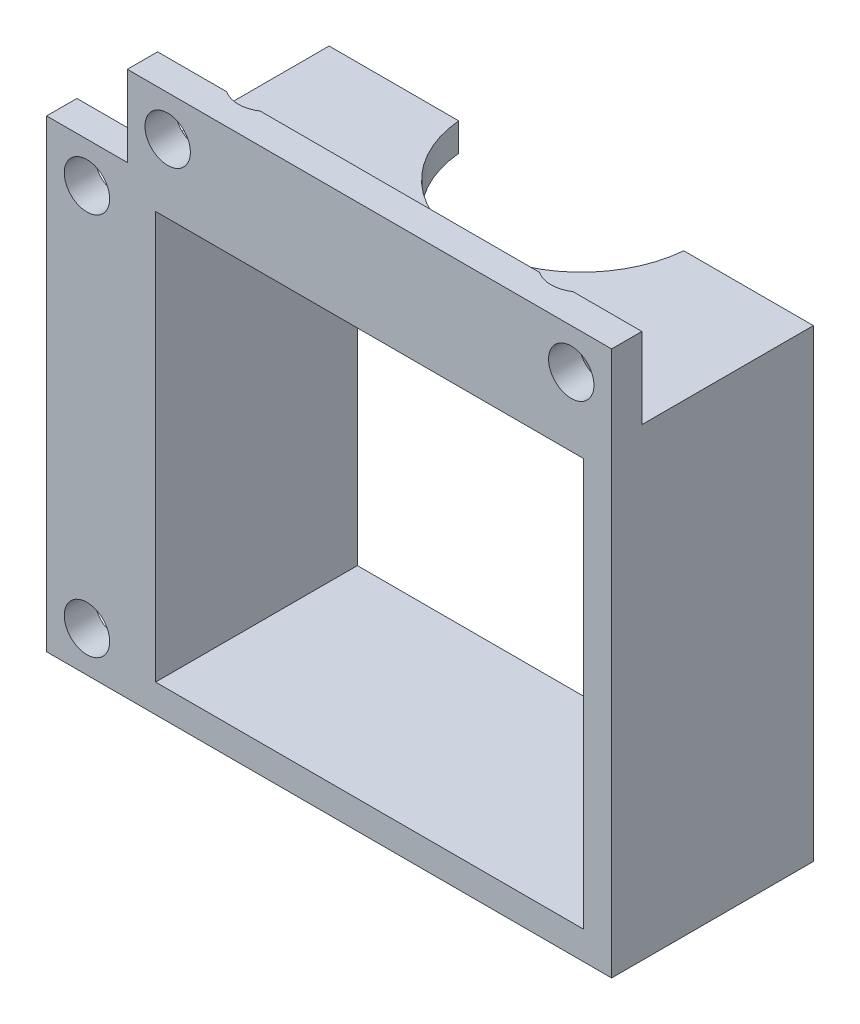
ISO-10303-21;
HEADER;
FILE_DESCRIPTION(('STEP AP214'),'2;1');
FILE_NAME('part.step','',(''),(''),'','','');
FILE_SCHEMA(('AUTOMOTIVE_DESIGN { 1 0 10303 214 1 1 1 1 }'));
ENDSEC;
DATA;
#1=APPLICATION_CONTEXT('core data for automotive mechanical design processes');
#2=APPLICATION_PROTOCOL_DEFINITION('international standard','automotive_design',2000,#1);
#3=PRODUCT_CONTEXT('',#1,'mechanical');
#4=PRODUCT('Part','Part','',(#3));
#5=PRODUCT_RELATED_PRODUCT_CATEGORY('part','',(#4));
#6=PRODUCT_DEFINITION_FORMATION('','',#4);
#7=PRODUCT_DEFINITION_CONTEXT('part definition',#1,'design');
#8=PRODUCT_DEFINITION('design','',#6,#7);
#9=PRODUCT_DEFINITION_SHAPE('','',#8);
#10=(LENGTH_UNIT() NAMED_UNIT(*) SI_UNIT(.MILLI.,.METRE.));
#11=(NAMED_UNIT(*) PLANE_ANGLE_UNIT() SI_UNIT($,.RADIAN.));
#12=(NAMED_UNIT(*) SI_UNIT($,.STERADIAN.) SOLID_ANGLE_UNIT());
#13=UNCERTAINTY_MEASURE_WITH_UNIT(LENGTH_MEASURE(1.E-05),#10,'distance_accuracy_value','');
#14=(GEOMETRIC_REPRESENTATION_CONTEXT(3) GLOBAL_UNCERTAINTY_ASSIGNED_CONTEXT((#13)) GLOBAL_UNIT_ASSIGNED_CONTEXT((#10,
#11,#12)) REPRESENTATION_CONTEXT('',''));
#15=CARTESIAN_POINT('',(0.,0.,0.));
#16=DIRECTION('',(0.,0.,1.));
#17=DIRECTION('',(1.,0.,0.));
#18=AXIS2_PLACEMENT_3D('',#15,#16,#17);
#19=CARTESIAN_POINT('',(0.,0.,-3.));
#20=DIRECTION('',(0.,0.,1.));
#21=DIRECTION('',(1.,0.,0.));
#22=AXIS2_PLACEMENT_3D('',#19,#20,#21);
#23=PLANE('',#22);
#24=CARTESIAN_POINT('',(15.8932700007655,-22.5,-3.));
#25=DIRECTION('',(0.,0.,1.));
#26=DIRECTION('',(1.,0.,0.));
#27=AXIS2_PLACEMENT_3D('',#24,#25,#26);
#28=CIRCLE('',#27,2.25);
#29=CARTESIAN_POINT('',(18.1432700007655,-22.5,-3.));
#30=VERTEX_POINT('',#29);
#31=EDGE_CURVE('E191',#30,#30,#28,.T.);
#32=ORIENTED_EDGE('',*,*,#31,.T.);
#33=EDGE_LOOP('',(#32));
#34=FACE_BOUND('',#33,.T.);
#35=DIRECTION('',(-1.,0.,0.));
#36=VECTOR('',#35,1.);
#37=CARTESIAN_POINT('',(0.,-26.5,-3.));
#38=LINE('',#37,#36);
#39=CARTESIAN_POINT('',(19.8932700007655,-26.5,-3.));
#40=VERTEX_POINT('',#39);
#41=CARTESIAN_POINT('',(13.0515823959432,-26.5,-3.));
#42=VERTEX_POINT('',#41);
#43=EDGE_CURVE('E189',#40,#42,#38,.T.);
#44=ORIENTED_EDGE('',*,*,#43,.T.);
#45=DIRECTION('',(0.,1.,0.));
#46=VECTOR('',#45,1.);
#47=CARTESIAN_POINT('',(13.0515823959432,-34.9852813742386,-3.));
#48=LINE('',#47,#46);
#49=CARTESIAN_POINT('',(13.0515823959432,-18.5,-3.));
#50=VERTEX_POINT('',#49);
#51=EDGE_CURVE('E11',#42,#50,#48,.T.);
#52=ORIENTED_EDGE('',*,*,#51,.T.);
#53=DIRECTION('',(-1.,0.,0.));
#54=VECTOR('',#53,1.);
#55=CARTESIAN_POINT('',(0.,-18.5,-3.));
#56=LINE('',#55,#54);
#57=CARTESIAN_POINT('',(19.8932700007655,-18.5,-3.));
#58=VERTEX_POINT('',#57);
#59=EDGE_CURVE('E224',#58,#50,#56,.T.);
#60=ORIENTED_EDGE('',*,*,#59,.F.);
#61=DIRECTION('',(0.,-1.,0.));
#62=VECTOR('',#61,1.);
#63=CARTESIAN_POINT('',(19.8932700007655,0.,-3.));
#64=LINE('',#63,#62);
#65=EDGE_CURVE('E187',#58,#40,#64,.T.);
#66=ORIENTED_EDGE('',*,*,#65,.T.);
#67=EDGE_LOOP('',(#44,#52,#60,#66));
#68=FACE_BOUND('',#67,.T.);
#69=ADVANCED_FACE('F37',(#34,#68),#23,.F.);
#70=CARTESIAN_POINT('',(9.7349576055878,-18.5,-3.));
#71=VERTEX_POINT('',#70);
#72=CARTESIAN_POINT('',(-17.9484176040568,-18.5,-3.));
#73=VERTEX_POINT('',#72);
#74=EDGE_CURVE('E228',#71,#73,#56,.T.);
#75=ORIENTED_EDGE('',*,*,#74,.F.);
#76=DIRECTION('',(0.,1.,0.));
#77=VECTOR('',#76,1.);
#78=CARTESIAN_POINT('',(9.7349576055878,-34.9852813742386,-3.));
#79=LINE('',#78,#77);
#80=CARTESIAN_POINT('',(9.7349576055878,-26.5,-3.));
#81=VERTEX_POINT('',#80);
#82=EDGE_CURVE('E45',#71,#81,#79,.F.);
#83=ORIENTED_EDGE('',*,*,#82,.T.);
#84=CARTESIAN_POINT('',(-17.9484176040568,-26.5,-3.));
#85=VERTEX_POINT('',#84);
#86=EDGE_CURVE('E186',#81,#85,#38,.T.);
#87=ORIENTED_EDGE('',*,*,#86,.T.);
#88=DIRECTION('',(0.,1.,0.));
#89=VECTOR('',#88,1.);
#90=CARTESIAN_POINT('',(-17.9484176040568,-34.9852813742386,-3.));
#91=LINE('',#90,#89);
#92=EDGE_CURVE('E167',#85,#73,#91,.T.);
#93=ORIENTED_EDGE('',*,*,#92,.T.);
#94=EDGE_LOOP('',(#75,#83,#87,#93));
#95=FACE_BOUND('',#94,.T.);
#96=ADVANCED_FACE('F347',(#95),#23,.F.);
#97=CARTESIAN_POINT('',(-28.1067299992345,-26.5,-20.));
#98=DIRECTION('',(0.,1.,0.));
#99=DIRECTION('',(0.,0.,1.));
#100=AXIS2_PLACEMENT_3D('',#97,#98,#99);
#101=PLANE('',#100);
#102=DIRECTION('',(0.,0.,1.));
#103=VECTOR('',#102,1.);
#104=CARTESIAN_POINT('',(-28.1067299992345,-26.5,-3.));
#105=LINE('',#104,#103);
#106=CARTESIAN_POINT('',(-28.1067299992345,-26.5,-3.));
#107=VERTEX_POINT('',#106);
#108=CARTESIAN_POINT('',(-28.1067299992345,-26.5,0.));
#109=VERTEX_POINT('',#108);
#110=EDGE_CURVE('E217',#107,#109,#105,.T.);
#111=ORIENTED_EDGE('',*,*,#110,.F.);
#112=DIRECTION('',(-1.,0.,0.));
#113=VECTOR('',#112,1.);
#114=CARTESIAN_POINT('',(0.,-26.5,-3.));
#115=LINE('',#114,#113);
#116=CARTESIAN_POINT('',(-36.1067299992345,-26.5,-3.));
#117=VERTEX_POINT('',#116);
#118=EDGE_CURVE('E243',#107,#117,#115,.T.);
#119=ORIENTED_EDGE('',*,*,#118,.T.);
#120=DIRECTION('',(0.,0.,1.));
#121=VECTOR('',#120,1.);
#122=CARTESIAN_POINT('',(-36.1067299992345,-26.5,-3.));
#123=LINE('',#122,#121);
#124=CARTESIAN_POINT('',(-36.1067299992345,-26.5,0.));
#125=VERTEX_POINT('',#124);
#126=EDGE_CURVE('E250',#117,#125,#123,.T.);
#127=ORIENTED_EDGE('',*,*,#126,.T.);
#128=DIRECTION('',(-1.,0.,0.));
#129=VECTOR('',#128,1.);
#130=CARTESIAN_POINT('',(-28.1067299992345,-26.5,0.));
#131=LINE('',#130,#129);
#132=EDGE_CURVE('E321',#109,#125,#131,.T.);
#133=ORIENTED_EDGE('',*,*,#132,.F.);
#134=EDGE_LOOP('',(#111,#119,#127,#133));
#135=FACE_BOUND('',#134,.T.);
#136=ADVANCED_FACE('F372',(#135),#101,.T.);
#137=CARTESIAN_POINT('',(-28.1067299992345,-26.5,-20.));
#138=DIRECTION('',(-1.,0.,0.));
#139=DIRECTION('',(0.,0.,1.));
#140=AXIS2_PLACEMENT_3D('',#137,#138,#139);
#141=PLANE('',#140);
#142=DIRECTION('',(0.,-1.,0.));
#143=VECTOR('',#142,1.);
#144=CARTESIAN_POINT('',(-28.1067299992345,0.,-3.));
#145=LINE('',#144,#143);
#146=CARTESIAN_POINT('',(-28.1067299992345,-72.5,-3.));
#147=VERTEX_POINT('',#146);
#148=EDGE_CURVE('E240',#107,#147,#145,.T.);
#149=ORIENTED_EDGE('',*,*,#148,.F.);
#150=DIRECTION('',(0.,0.,1.));
#151=VECTOR('',#150,1.);
#152=CARTESIAN_POINT('',(-28.1067299992345,-26.5,-20.));
#153=LINE('',#152,#151);
#154=CARTESIAN_POINT('',(-28.1067299992345,-26.5,-20.));
#155=VERTEX_POINT('',#154);
#156=EDGE_CURVE('E179',#155,#107,#153,.T.);
#157=ORIENTED_EDGE('',*,*,#156,.F.);
#158=DIRECTION('',(0.,-1.,0.));
#159=VECTOR('',#158,1.);
#160=CARTESIAN_POINT('',(-28.1067299992345,-26.5,-20.));
#161=LINE('',#160,#159);
#162=CARTESIAN_POINT('',(-28.1067299992345,-72.5,-20.));
#163=VERTEX_POINT('',#162);
#164=EDGE_CURVE('E317',#155,#163,#161,.T.);
#165=ORIENTED_EDGE('',*,*,#164,.T.);
#166=DIRECTION('',(0.,0.,1.));
#167=VECTOR('',#166,1.);
#168=CARTESIAN_POINT('',(-28.1067299992345,-72.5,-20.));
#169=LINE('',#168,#167);
#170=EDGE_CURVE('E331',#163,#147,#169,.T.);
#171=ORIENTED_EDGE('',*,*,#170,.T.);
#172=EDGE_LOOP('',(#149,#157,#165,#171));
#173=FACE_BOUND('',#172,.T.);
#174=ADVANCED_FACE('F39',(#173),#141,.T.);
#175=ORIENTED_EDGE('',*,*,#86,.F.);
#176=CARTESIAN_POINT('',(11.3932700007655,-26.5,-5.5));
#177=DIRECTION('',(0.,1.,0.));
#178=DIRECTION('',(0.,0.,1.));
#179=AXIS2_PLACEMENT_3D('',#176,#177,#178);
#180=CIRCLE('',#179,3.);
#181=EDGE_CURVE('E58',#42,#81,#180,.F.);
#182=ORIENTED_EDGE('',*,*,#181,.F.);
#183=ORIENTED_EDGE('',*,*,#43,.F.);
#184=DIRECTION('',(0.,0.,1.));
#185=VECTOR('',#184,1.);
#186=CARTESIAN_POINT('',(19.8932700007655,-26.5,-20.));
#187=LINE('',#186,#185);
#188=CARTESIAN_POINT('',(19.8932700007655,-26.5,-20.));
#189=VERTEX_POINT('',#188);
#190=EDGE_CURVE('E338',#189,#40,#187,.T.);
#191=ORIENTED_EDGE('',*,*,#190,.F.);
#192=DIRECTION('',(-1.,0.,0.));
#193=VECTOR('',#192,1.);
#194=CARTESIAN_POINT('',(-28.1067299992345,-26.5,-20.));
#195=LINE('',#194,#193);
#196=CARTESIAN_POINT('',(7.04853781467297,-26.5,-20.));
#197=VERTEX_POINT('',#196);
#198=EDGE_CURVE('E328',#189,#197,#195,.T.);
#199=ORIENTED_EDGE('',*,*,#198,.T.);
#200=CARTESIAN_POINT('',(-4.1067299992345,-26.5,-21.));
#201=DIRECTION('',(0.,1.,0.));
#202=DIRECTION('',(0.,0.,1.));
#203=AXIS2_PLACEMENT_3D('',#200,#201,#202);
#204=CIRCLE('',#203,11.2);
#205=CARTESIAN_POINT('',(-15.261997813142,-26.5,-20.));
#206=VERTEX_POINT('',#205);
#207=EDGE_CURVE('E279',#206,#197,#204,.T.);
#208=ORIENTED_EDGE('',*,*,#207,.F.);
#209=EDGE_CURVE('E327',#206,#155,#195,.T.);
#210=ORIENTED_EDGE('',*,*,#209,.T.);
#211=ORIENTED_EDGE('',*,*,#156,.T.);
#212=CARTESIAN_POINT('',(-21.2650423944122,-26.5,-3.));
#213=VERTEX_POINT('',#212);
#214=EDGE_CURVE('E176',#213,#107,#38,.T.);
#215=ORIENTED_EDGE('',*,*,#214,.F.);
#216=CARTESIAN_POINT('',(-19.6067299992345,-26.5,-5.5));
#217=DIRECTION('',(0.,1.,0.));
#218=DIRECTION('',(0.,0.,1.));
#219=AXIS2_PLACEMENT_3D('',#216,#217,#218);
#220=CIRCLE('',#219,3.);
#221=EDGE_CURVE('E52',#85,#213,#220,.F.);
#222=ORIENTED_EDGE('',*,*,#221,.F.);
#223=EDGE_LOOP('',(#175,#182,#183,#191,#199,#208,#210,#211,#215,#222));
#224=FACE_BOUND('',#223,.T.);
#225=CARTESIAN_POINT('',(-19.6067299992345,-26.5,-5.5));
#226=DIRECTION('',(0.,1.,0.));
#227=DIRECTION('',(0.,0.,1.));
#228=AXIS2_PLACEMENT_3D('',#225,#226,#227);
#229=CIRCLE('',#228,1.7);
#230=CARTESIAN_POINT('',(-19.6067299992345,-26.5,-3.8));
#231=VERTEX_POINT('',#230);
#232=EDGE_CURVE('E261',#231,#231,#229,.T.);
#233=ORIENTED_EDGE('',*,*,#232,.F.);
#234=EDGE_LOOP('',(#233));
#235=FACE_BOUND('',#234,.T.);
#236=CARTESIAN_POINT('',(11.3932700007655,-26.5,-5.5));
#237=DIRECTION('',(0.,1.,0.));
#238=DIRECTION('',(0.,0.,1.));
#239=AXIS2_PLACEMENT_3D('',#236,#237,#238);
#240=CIRCLE('',#239,1.7);
#241=CARTESIAN_POINT('',(11.3932700007655,-26.5,-3.8));
#242=VERTEX_POINT('',#241);
#243=EDGE_CURVE('E264',#242,#242,#240,.T.);
#244=ORIENTED_EDGE('',*,*,#243,.F.);
#245=EDGE_LOOP('',(#244));
#246=FACE_BOUND('',#245,.T.);
#247=ADVANCED_FACE('F182',(#224,#235,#246),#101,.T.);
#248=CARTESIAN_POINT('',(19.8932700007655,-26.5,-20.));
#249=DIRECTION('',(1.,0.,0.));
#250=DIRECTION('',(0.,1.,0.));
#251=AXIS2_PLACEMENT_3D('',#248,#249,#250);
#252=PLANE('',#251);
#253=DIRECTION('',(0.,1.,0.));
#254=VECTOR('',#253,1.);
#255=CARTESIAN_POINT('',(19.8932700007655,-26.5,0.));
#256=LINE('',#255,#254);
#257=CARTESIAN_POINT('',(19.8932700007655,-72.5,0.));
#258=VERTEX_POINT('',#257);
#259=CARTESIAN_POINT('',(19.8932700007655,-18.5,0.));
#260=VERTEX_POINT('',#259);
#261=EDGE_CURVE('E334',#258,#260,#256,.T.);
#262=ORIENTED_EDGE('',*,*,#261,.F.);
#263=DIRECTION('',(0.,0.,1.));
#264=VECTOR('',#263,1.);
#265=CARTESIAN_POINT('',(19.8932700007655,-72.5,-20.));
#266=LINE('',#265,#264);
#267=CARTESIAN_POINT('',(19.8932700007655,-72.5,-20.));
#268=VERTEX_POINT('',#267);
#269=EDGE_CURVE('E341',#268,#258,#266,.T.);
#270=ORIENTED_EDGE('',*,*,#269,.F.);
#271=DIRECTION('',(0.,1.,0.));
#272=VECTOR('',#271,1.);
#273=CARTESIAN_POINT('',(19.8932700007655,-26.5,-20.));
#274=LINE('',#273,#272);
#275=EDGE_CURVE('E324',#268,#189,#274,.T.);
#276=ORIENTED_EDGE('',*,*,#275,.T.);
#277=ORIENTED_EDGE('',*,*,#190,.T.);
#278=ORIENTED_EDGE('',*,*,#65,.F.);
#279=DIRECTION('',(0.,0.,1.));
#280=VECTOR('',#279,1.);
#281=CARTESIAN_POINT('',(19.8932700007655,-18.5,-3.));
#282=LINE('',#281,#280);
#283=EDGE_CURVE('E211',#58,#260,#282,.T.);
#284=ORIENTED_EDGE('',*,*,#283,.T.);
#285=EDGE_LOOP('',(#262,#270,#276,#277,#278,#284));
#286=FACE_BOUND('',#285,.T.);
#287=ADVANCED_FACE('F363',(#286),#252,.T.);
#288=CARTESIAN_POINT('',(-28.1067299992345,-72.5,-20.));
#289=DIRECTION('',(0.,-1.,0.));
#290=DIRECTION('',(0.,0.,-1.));
#291=AXIS2_PLACEMENT_3D('',#288,#289,#290);
#292=PLANE('',#291);
#293=DIRECTION('',(1.,0.,0.));
#294=VECTOR('',#293,1.);
#295=CARTESIAN_POINT('',(-28.1067299992345,-72.5,0.));
#296=LINE('',#295,#294);
#297=CARTESIAN_POINT('',(-36.1067299992345,-72.5,0.));
#298=VERTEX_POINT('',#297);
#299=EDGE_CURVE('E310',#298,#258,#296,.T.);
#300=ORIENTED_EDGE('',*,*,#299,.F.);
#301=DIRECTION('',(0.,0.,1.));
#302=VECTOR('',#301,1.);
#303=CARTESIAN_POINT('',(-36.1067299992345,-72.5,-3.));
#304=LINE('',#303,#302);
#305=CARTESIAN_POINT('',(-36.1067299992345,-72.5,-3.));
#306=VERTEX_POINT('',#305);
#307=EDGE_CURVE('E258',#306,#298,#304,.T.);
#308=ORIENTED_EDGE('',*,*,#307,.F.);
#309=DIRECTION('',(-1.,0.,0.));
#310=VECTOR('',#309,1.);
#311=CARTESIAN_POINT('',(0.,-72.5,-3.));
#312=LINE('',#311,#310);
#313=EDGE_CURVE('E248',#147,#306,#312,.T.);
#314=ORIENTED_EDGE('',*,*,#313,.F.);
#315=ORIENTED_EDGE('',*,*,#170,.F.);
#316=DIRECTION('',(1.,0.,0.));
#317=VECTOR('',#316,1.);
#318=CARTESIAN_POINT('',(-28.1067299992345,-72.5,-20.));
#319=LINE('',#318,#317);
#320=EDGE_CURVE('E320',#163,#268,#319,.T.);
#321=ORIENTED_EDGE('',*,*,#320,.T.);
#322=ORIENTED_EDGE('',*,*,#269,.T.);
#323=EDGE_LOOP('',(#300,#308,#314,#315,#321,#322));
#324=FACE_BOUND('',#323,.T.);
#325=ADVANCED_FACE('F379',(#324),#292,.T.);
#326=CARTESIAN_POINT('',(0.,0.,-20.));
#327=DIRECTION('',(0.,0.,1.));
#328=DIRECTION('',(1.,0.,0.));
#329=AXIS2_PLACEMENT_3D('',#326,#327,#328);
#330=PLANE('',#329);
#331=DIRECTION('',(-1.,0.,0.));
#332=VECTOR('',#331,1.);
#333=CARTESIAN_POINT('',(-25.3067299992345,-29.3,-20.));
#334=LINE('',#333,#332);
#335=CARTESIAN_POINT('',(17.0932700007655,-29.3,-20.));
#336=VERTEX_POINT('',#335);
#337=CARTESIAN_POINT('',(7.04853781467297,-29.3,-20.));
#338=VERTEX_POINT('',#337);
#339=EDGE_CURVE('E295',#336,#338,#334,.T.);
#340=ORIENTED_EDGE('',*,*,#339,.T.);
#341=DIRECTION('',(0.,1.,0.));
#342=VECTOR('',#341,1.);
#343=CARTESIAN_POINT('',(7.04853781467297,-72.501,-20.));
#344=LINE('',#343,#342);
#345=EDGE_CURVE('E277',#197,#338,#344,.F.);
#346=ORIENTED_EDGE('',*,*,#345,.F.);
#347=ORIENTED_EDGE('',*,*,#198,.F.);
#348=ORIENTED_EDGE('',*,*,#275,.F.);
#349=ORIENTED_EDGE('',*,*,#320,.F.);
#350=ORIENTED_EDGE('',*,*,#164,.F.);
#351=ORIENTED_EDGE('',*,*,#209,.F.);
#352=DIRECTION('',(0.,1.,0.));
#353=VECTOR('',#352,1.);
#354=CARTESIAN_POINT('',(-15.261997813142,-72.501,-20.));
#355=LINE('',#354,#353);
#356=CARTESIAN_POINT('',(-15.261997813142,-29.3,-20.));
#357=VERTEX_POINT('',#356);
#358=EDGE_CURVE('E271',#357,#206,#355,.T.);
#359=ORIENTED_EDGE('',*,*,#358,.F.);
#360=CARTESIAN_POINT('',(-25.3067299992345,-29.3,-20.));
#361=VERTEX_POINT('',#360);
#362=EDGE_CURVE('E294',#357,#361,#334,.T.);
#363=ORIENTED_EDGE('',*,*,#362,.T.);
#364=DIRECTION('',(0.,-1.,0.));
#365=VECTOR('',#364,1.);
#366=CARTESIAN_POINT('',(-25.3067299992345,-29.3,-20.));
#367=LINE('',#366,#365);
#368=CARTESIAN_POINT('',(-25.3067299992345,-69.7,-20.));
#369=VERTEX_POINT('',#368);
#370=EDGE_CURVE('E284',#361,#369,#367,.T.);
#371=ORIENTED_EDGE('',*,*,#370,.T.);
#372=DIRECTION('',(1.,0.,0.));
#373=VECTOR('',#372,1.);
#374=CARTESIAN_POINT('',(-25.3067299992345,-69.7,-20.));
#375=LINE('',#374,#373);
#376=CARTESIAN_POINT('',(17.0932700007655,-69.7,-20.));
#377=VERTEX_POINT('',#376);
#378=EDGE_CURVE('E287',#369,#377,#375,.T.);
#379=ORIENTED_EDGE('',*,*,#378,.T.);
#380=DIRECTION('',(0.,1.,0.));
#381=VECTOR('',#380,1.);
#382=CARTESIAN_POINT('',(17.0932700007655,-29.3,-20.));
#383=LINE('',#382,#381);
#384=EDGE_CURVE('E291',#377,#336,#383,.T.);
#385=ORIENTED_EDGE('',*,*,#384,.T.);
#386=EDGE_LOOP('',(#340,#346,#347,#348,#349,#350,#351,#359,#363,#371,#379,#385));
#387=FACE_BOUND('',#386,.T.);
#388=ADVANCED_FACE('F384',(#387),#330,.F.);
#389=CARTESIAN_POINT('',(0.,0.,0.));
#390=DIRECTION('',(0.,0.,1.));
#391=DIRECTION('',(1.,0.,0.));
#392=AXIS2_PLACEMENT_3D('',#389,#390,#391);
#393=PLANE('',#392);
#394=DIRECTION('',(0.,-1.,0.));
#395=VECTOR('',#394,1.);
#396=CARTESIAN_POINT('',(-25.3067299992345,-29.3,0.));
#397=LINE('',#396,#395);
#398=CARTESIAN_POINT('',(-25.3067299992345,-29.3,0.));
#399=VERTEX_POINT('',#398);
#400=CARTESIAN_POINT('',(-25.3067299992345,-69.7,0.));
#401=VERTEX_POINT('',#400);
#402=EDGE_CURVE('E283',#399,#401,#397,.T.);
#403=ORIENTED_EDGE('',*,*,#402,.F.);
#404=DIRECTION('',(-1.,0.,0.));
#405=VECTOR('',#404,1.);
#406=CARTESIAN_POINT('',(-25.3067299992345,-29.3,0.));
#407=LINE('',#406,#405);
#408=CARTESIAN_POINT('',(17.0932700007655,-29.3,0.));
#409=VERTEX_POINT('',#408);
#410=EDGE_CURVE('E288',#409,#399,#407,.T.);
#411=ORIENTED_EDGE('',*,*,#410,.F.);
#412=DIRECTION('',(0.,1.,0.));
#413=VECTOR('',#412,1.);
#414=CARTESIAN_POINT('',(17.0932700007655,-29.3,0.));
#415=LINE('',#414,#413);
#416=CARTESIAN_POINT('',(17.0932700007655,-69.7,0.));
#417=VERTEX_POINT('',#416);
#418=EDGE_CURVE('E303',#417,#409,#415,.T.);
#419=ORIENTED_EDGE('',*,*,#418,.F.);
#420=DIRECTION('',(1.,0.,0.));
#421=VECTOR('',#420,1.);
#422=CARTESIAN_POINT('',(-25.3067299992345,-69.7,0.));
#423=LINE('',#422,#421);
#424=EDGE_CURVE('E300',#401,#417,#423,.T.);
#425=ORIENTED_EDGE('',*,*,#424,.F.);
#426=EDGE_LOOP('',(#403,#411,#419,#425));
#427=FACE_BOUND('',#426,.T.);
#428=ORIENTED_EDGE('',*,*,#261,.T.);
#429=DIRECTION('',(-1.,0.,0.));
#430=VECTOR('',#429,1.);
#431=CARTESIAN_POINT('',(0.,-18.5,0.));
#432=LINE('',#431,#430);
#433=CARTESIAN_POINT('',(-28.1067299992345,-18.5,0.));
#434=VERTEX_POINT('',#433);
#435=EDGE_CURVE('E195',#260,#434,#432,.T.);
#436=ORIENTED_EDGE('',*,*,#435,.T.);
#437=DIRECTION('',(0.,-1.,0.));
#438=VECTOR('',#437,1.);
#439=CARTESIAN_POINT('',(-28.1067299992345,0.,0.));
#440=LINE('',#439,#438);
#441=EDGE_CURVE('E198',#434,#109,#440,.T.);
#442=ORIENTED_EDGE('',*,*,#441,.T.);
#443=ORIENTED_EDGE('',*,*,#132,.T.);
#444=DIRECTION('',(0.,1.,0.));
#445=VECTOR('',#444,1.);
#446=CARTESIAN_POINT('',(-36.1067299992345,0.,0.));
#447=LINE('',#446,#445);
#448=EDGE_CURVE('E237',#298,#125,#447,.T.);
#449=ORIENTED_EDGE('',*,*,#448,.F.);
#450=ORIENTED_EDGE('',*,*,#299,.T.);
#451=EDGE_LOOP('',(#428,#436,#442,#443,#449,#450));
#452=FACE_BOUND('',#451,.T.);
#453=CARTESIAN_POINT('',(-32.1067299992345,-30.5,0.));
#454=DIRECTION('',(0.,0.,1.));
#455=DIRECTION('',(1.,0.,0.));
#456=AXIS2_PLACEMENT_3D('',#453,#454,#455);
#457=CIRCLE('',#456,2.25000000000001);
#458=CARTESIAN_POINT('',(-29.8567299992345,-30.5,0.));
#459=VERTEX_POINT('',#458);
#460=EDGE_CURVE('E203',#459,#459,#457,.T.);
#461=ORIENTED_EDGE('',*,*,#460,.F.);
#462=EDGE_LOOP('',(#461));
#463=FACE_BOUND('',#462,.T.);
#464=CARTESIAN_POINT('',(-32.1067299992345,-68.5,0.));
#465=DIRECTION('',(0.,0.,1.));
#466=DIRECTION('',(1.,0.,0.));
#467=AXIS2_PLACEMENT_3D('',#464,#465,#466);
#468=CIRCLE('',#467,2.25);
#469=CARTESIAN_POINT('',(-29.8567299992345,-68.5,0.));
#470=VERTEX_POINT('',#469);
#471=EDGE_CURVE('E253',#470,#470,#468,.T.);
#472=ORIENTED_EDGE('',*,*,#471,.F.);
#473=EDGE_LOOP('',(#472));
#474=FACE_BOUND('',#473,.T.);
#475=CARTESIAN_POINT('',(-24.1067299992345,-22.5,0.));
#476=DIRECTION('',(0.,0.,1.));
#477=DIRECTION('',(1.,0.,0.));
#478=AXIS2_PLACEMENT_3D('',#475,#476,#477);
#479=CIRCLE('',#478,2.25000000000001);
#480=CARTESIAN_POINT('',(-21.8567299992345,-22.5,0.));
#481=VERTEX_POINT('',#480);
#482=EDGE_CURVE('E210',#481,#481,#479,.T.);
#483=ORIENTED_EDGE('',*,*,#482,.F.);
#484=EDGE_LOOP('',(#483));
#485=FACE_BOUND('',#484,.T.);
#486=CARTESIAN_POINT('',(15.8932700007655,-22.5,0.));
#487=DIRECTION('',(0.,0.,1.));
#488=DIRECTION('',(1.,0.,0.));
#489=AXIS2_PLACEMENT_3D('',#486,#487,#488);
#490=CIRCLE('',#489,2.25);
#491=CARTESIAN_POINT('',(18.1432700007655,-22.5,0.));
#492=VERTEX_POINT('',#491);
#493=EDGE_CURVE('E207',#492,#492,#490,.T.);
#494=ORIENTED_EDGE('',*,*,#493,.F.);
#495=EDGE_LOOP('',(#494));
#496=FACE_BOUND('',#495,.T.);
#497=ADVANCED_FACE('F367',(#427,#452,#463,#474,#485,#496),#393,.T.);
#498=CARTESIAN_POINT('',(-25.3067299992345,-29.3,-20.));
#499=DIRECTION('',(-1.,0.,0.));
#500=DIRECTION('',(0.,0.,1.));
#501=AXIS2_PLACEMENT_3D('',#498,#499,#500);
#502=PLANE('',#501);
#503=ORIENTED_EDGE('',*,*,#402,.T.);
#504=DIRECTION('',(0.,0.,1.));
#505=VECTOR('',#504,1.);
#506=CARTESIAN_POINT('',(-25.3067299992345,-69.7,-20.));
#507=LINE('',#506,#505);
#508=EDGE_CURVE('E298',#369,#401,#507,.T.);
#509=ORIENTED_EDGE('',*,*,#508,.F.);
#510=ORIENTED_EDGE('',*,*,#370,.F.);
#511=DIRECTION('',(0.,0.,1.));
#512=VECTOR('',#511,1.);
#513=CARTESIAN_POINT('',(-25.3067299992345,-29.3,-20.));
#514=LINE('',#513,#512);
#515=EDGE_CURVE('E308',#361,#399,#514,.T.);
#516=ORIENTED_EDGE('',*,*,#515,.T.);
#517=EDGE_LOOP('',(#503,#509,#510,#516));
#518=FACE_BOUND('',#517,.T.);
#519=ADVANCED_FACE('F454',(#518),#502,.F.);
#520=CARTESIAN_POINT('',(-25.3067299992345,-29.3,-20.));
#521=DIRECTION('',(0.,1.,0.));
#522=DIRECTION('',(0.,0.,1.));
#523=AXIS2_PLACEMENT_3D('',#520,#521,#522);
#524=PLANE('',#523);
#525=CARTESIAN_POINT('',(11.3932700007655,-29.3,-5.5));
#526=DIRECTION('',(0.,1.,0.));
#527=DIRECTION('',(0.,0.,1.));
#528=AXIS2_PLACEMENT_3D('',#525,#526,#527);
#529=CIRCLE('',#528,1.7);
#530=CARTESIAN_POINT('',(11.3932700007655,-29.3,-3.8));
#531=VERTEX_POINT('',#530);
#532=EDGE_CURVE('E267',#531,#531,#529,.F.);
#533=ORIENTED_EDGE('',*,*,#532,.F.);
#534=EDGE_LOOP('',(#533));
#535=FACE_BOUND('',#534,.T.);
#536=CARTESIAN_POINT('',(-19.6067299992345,-29.3,-5.5));
#537=DIRECTION('',(0.,1.,0.));
#538=DIRECTION('',(0.,0.,1.));
#539=AXIS2_PLACEMENT_3D('',#536,#537,#538);
#540=CIRCLE('',#539,1.7);
#541=CARTESIAN_POINT('',(-19.6067299992345,-29.3,-3.8));
#542=VERTEX_POINT('',#541);
#543=EDGE_CURVE('E268',#542,#542,#540,.F.);
#544=ORIENTED_EDGE('',*,*,#543,.F.);
#545=EDGE_LOOP('',(#544));
#546=FACE_BOUND('',#545,.T.);
#547=ORIENTED_EDGE('',*,*,#362,.F.);
#548=CARTESIAN_POINT('',(-4.1067299992345,-29.3,-21.));
#549=DIRECTION('',(0.,1.,0.));
#550=DIRECTION('',(0.,0.,1.));
#551=AXIS2_PLACEMENT_3D('',#548,#549,#550);
#552=CIRCLE('',#551,11.2);
#553=EDGE_CURVE('E281',#338,#357,#552,.F.);
#554=ORIENTED_EDGE('',*,*,#553,.F.);
#555=ORIENTED_EDGE('',*,*,#339,.F.);
#556=DIRECTION('',(0.,0.,1.));
#557=VECTOR('',#556,1.);
#558=CARTESIAN_POINT('',(17.0932700007655,-29.3,-20.));
#559=LINE('',#558,#557);
#560=EDGE_CURVE('E311',#336,#409,#559,.T.);
#561=ORIENTED_EDGE('',*,*,#560,.T.);
#562=ORIENTED_EDGE('',*,*,#410,.T.);
#563=ORIENTED_EDGE('',*,*,#515,.F.);
#564=EDGE_LOOP('',(#547,#554,#555,#561,#562,#563));
#565=FACE_BOUND('',#564,.T.);
#566=ADVANCED_FACE('F450',(#535,#546,#565),#524,.F.);
#567=CARTESIAN_POINT('',(17.0932700007655,-29.3,-20.));
#568=DIRECTION('',(1.,0.,0.));
#569=DIRECTION('',(0.,0.,-1.));
#570=AXIS2_PLACEMENT_3D('',#567,#568,#569);
#571=PLANE('',#570);
#572=ORIENTED_EDGE('',*,*,#418,.T.);
#573=ORIENTED_EDGE('',*,*,#560,.F.);
#574=ORIENTED_EDGE('',*,*,#384,.F.);
#575=DIRECTION('',(0.,0.,1.));
#576=VECTOR('',#575,1.);
#577=CARTESIAN_POINT('',(17.0932700007655,-69.7,-20.));
#578=LINE('',#577,#576);
#579=EDGE_CURVE('E313',#377,#417,#578,.T.);
#580=ORIENTED_EDGE('',*,*,#579,.T.);
#581=EDGE_LOOP('',(#572,#573,#574,#580));
#582=FACE_BOUND('',#581,.T.);
#583=ADVANCED_FACE('F453',(#582),#571,.F.);
#584=CARTESIAN_POINT('',(-25.3067299992345,-69.7,-20.));
#585=DIRECTION('',(0.,-1.,0.));
#586=DIRECTION('',(0.,0.,-1.));
#587=AXIS2_PLACEMENT_3D('',#584,#585,#586);
#588=PLANE('',#587);
#589=ORIENTED_EDGE('',*,*,#424,.T.);
#590=ORIENTED_EDGE('',*,*,#579,.F.);
#591=ORIENTED_EDGE('',*,*,#378,.F.);
#592=ORIENTED_EDGE('',*,*,#508,.T.);
#593=EDGE_LOOP('',(#589,#590,#591,#592));
#594=FACE_BOUND('',#593,.T.);
#595=ADVANCED_FACE('F448',(#594),#588,.F.);
#596=CARTESIAN_POINT('',(-4.1067299992345,-72.501,-21.));
#597=DIRECTION('',(0.,1.,0.));
#598=DIRECTION('',(0.,0.,1.));
#599=AXIS2_PLACEMENT_3D('',#596,#597,#598);
#600=CYLINDRICAL_SURFACE('',#599,11.2);
#601=ORIENTED_EDGE('',*,*,#345,.T.);
#602=ORIENTED_EDGE('',*,*,#553,.T.);
#603=ORIENTED_EDGE('',*,*,#358,.T.);
#604=ORIENTED_EDGE('',*,*,#207,.T.);
#605=EDGE_LOOP('',(#601,#602,#603,#604));
#606=FACE_BOUND('',#605,.T.);
#607=ADVANCED_FACE('F444',(#606),#600,.F.);
#608=CARTESIAN_POINT('',(-19.6067299992345,-72.501,-5.5));
#609=DIRECTION('',(0.,1.,0.));
#610=DIRECTION('',(0.,0.,1.));
#611=AXIS2_PLACEMENT_3D('',#608,#609,#610);
#612=CYLINDRICAL_SURFACE('',#611,1.7);
#613=ORIENTED_EDGE('',*,*,#232,.T.);
#614=EDGE_LOOP('',(#613));
#615=FACE_BOUND('',#614,.T.);
#616=ORIENTED_EDGE('',*,*,#543,.T.);
#617=EDGE_LOOP('',(#616));
#618=FACE_BOUND('',#617,.T.);
#619=ADVANCED_FACE('F440',(#615,#618),#612,.F.);
#620=CARTESIAN_POINT('',(11.3932700007655,-72.501,-5.5));
#621=DIRECTION('',(0.,1.,0.));
#622=DIRECTION('',(0.,0.,1.));
#623=AXIS2_PLACEMENT_3D('',#620,#621,#622);
#624=CYLINDRICAL_SURFACE('',#623,1.7);
#625=ORIENTED_EDGE('',*,*,#243,.T.);
#626=EDGE_LOOP('',(#625));
#627=FACE_BOUND('',#626,.T.);
#628=ORIENTED_EDGE('',*,*,#532,.T.);
#629=EDGE_LOOP('',(#628));
#630=FACE_BOUND('',#629,.T.);
#631=ADVANCED_FACE('F434',(#627,#630),#624,.F.);
#632=CARTESIAN_POINT('',(-36.1067299992345,0.,-3.));
#633=DIRECTION('',(1.,0.,0.));
#634=DIRECTION('',(0.,0.,-1.));
#635=AXIS2_PLACEMENT_3D('',#632,#633,#634);
#636=PLANE('',#635);
#637=ORIENTED_EDGE('',*,*,#448,.T.);
#638=ORIENTED_EDGE('',*,*,#126,.F.);
#639=DIRECTION('',(0.,1.,0.));
#640=VECTOR('',#639,1.);
#641=CARTESIAN_POINT('',(-36.1067299992345,0.,-3.));
#642=LINE('',#641,#640);
#643=EDGE_CURVE('E246',#306,#117,#642,.T.);
#644=ORIENTED_EDGE('',*,*,#643,.F.);
#645=ORIENTED_EDGE('',*,*,#307,.T.);
#646=EDGE_LOOP('',(#637,#638,#644,#645));
#647=FACE_BOUND('',#646,.T.);
#648=ADVANCED_FACE('F375',(#647),#636,.F.);
#649=CARTESIAN_POINT('',(-32.1067299992345,-68.5,-3.));
#650=DIRECTION('',(0.,0.,1.));
#651=DIRECTION('',(1.,0.,0.));
#652=AXIS2_PLACEMENT_3D('',#649,#650,#651);
#653=CYLINDRICAL_SURFACE('',#652,2.25);
#654=CARTESIAN_POINT('',(-32.1067299992345,-68.5,-3.));
#655=DIRECTION('',(0.,0.,1.));
#656=DIRECTION('',(1.,0.,0.));
#657=AXIS2_PLACEMENT_3D('',#654,#655,#656);
#658=CIRCLE('',#657,2.25);
#659=CARTESIAN_POINT('',(-29.8567299992345,-68.5,-3.));
#660=VERTEX_POINT('',#659);
#661=EDGE_CURVE('E236',#660,#660,#658,.T.);
#662=ORIENTED_EDGE('',*,*,#661,.F.);
#663=EDGE_LOOP('',(#662));
#664=FACE_BOUND('',#663,.T.);
#665=ORIENTED_EDGE('',*,*,#471,.T.);
#666=EDGE_LOOP('',(#665));
#667=FACE_BOUND('',#666,.T.);
#668=ADVANCED_FACE('F427',(#664,#667),#653,.F.);
#669=CARTESIAN_POINT('',(-32.1067299992345,-30.5,-3.));
#670=DIRECTION('',(0.,0.,1.));
#671=DIRECTION('',(1.,0.,0.));
#672=AXIS2_PLACEMENT_3D('',#669,#670,#671);
#673=CYLINDRICAL_SURFACE('',#672,2.25000000000001);
#674=CARTESIAN_POINT('',(-32.1067299992345,-30.5,-3.));
#675=DIRECTION('',(0.,0.,1.));
#676=DIRECTION('',(1.,0.,0.));
#677=AXIS2_PLACEMENT_3D('',#674,#675,#676);
#678=CIRCLE('',#677,2.25000000000001);
#679=CARTESIAN_POINT('',(-29.8567299992345,-30.5,-3.));
#680=VERTEX_POINT('',#679);
#681=EDGE_CURVE('E233',#680,#680,#678,.T.);
#682=ORIENTED_EDGE('',*,*,#681,.F.);
#683=EDGE_LOOP('',(#682));
#684=FACE_BOUND('',#683,.T.);
#685=ORIENTED_EDGE('',*,*,#460,.T.);
#686=EDGE_LOOP('',(#685));
#687=FACE_BOUND('',#686,.T.);
#688=ADVANCED_FACE('F422',(#684,#687),#673,.F.);
#689=CARTESIAN_POINT('',(0.,0.,-3.));
#690=DIRECTION('',(0.,0.,1.));
#691=DIRECTION('',(1.,0.,0.));
#692=AXIS2_PLACEMENT_3D('',#689,#690,#691);
#693=PLANE('',#692);
#694=ORIENTED_EDGE('',*,*,#681,.T.);
#695=EDGE_LOOP('',(#694));
#696=FACE_BOUND('',#695,.T.);
#697=ORIENTED_EDGE('',*,*,#661,.T.);
#698=EDGE_LOOP('',(#697));
#699=FACE_BOUND('',#698,.T.);
#700=ORIENTED_EDGE('',*,*,#148,.T.);
#701=ORIENTED_EDGE('',*,*,#313,.T.);
#702=ORIENTED_EDGE('',*,*,#643,.T.);
#703=ORIENTED_EDGE('',*,*,#118,.F.);
#704=EDGE_LOOP('',(#700,#701,#702,#703));
#705=FACE_BOUND('',#704,.T.);
#706=ADVANCED_FACE('F418',(#696,#699,#705),#693,.F.);
#707=CARTESIAN_POINT('',(0.,-18.5,-3.));
#708=DIRECTION('',(0.,1.,0.));
#709=DIRECTION('',(0.,0.,1.));
#710=AXIS2_PLACEMENT_3D('',#707,#708,#709);
#711=PLANE('',#710);
#712=CARTESIAN_POINT('',(11.3932700007655,-18.5,-5.5));
#713=DIRECTION('',(0.,1.,0.));
#714=DIRECTION('',(0.,0.,1.));
#715=AXIS2_PLACEMENT_3D('',#712,#713,#714);
#716=CIRCLE('',#715,3.);
#717=EDGE_CURVE('E169',#71,#50,#716,.T.);
#718=ORIENTED_EDGE('',*,*,#717,.F.);
#719=ORIENTED_EDGE('',*,*,#74,.T.);
#720=CARTESIAN_POINT('',(-19.6067299992345,-18.5,-5.5));
#721=DIRECTION('',(0.,1.,0.));
#722=DIRECTION('',(0.,0.,1.));
#723=AXIS2_PLACEMENT_3D('',#720,#721,#722);
#724=CIRCLE('',#723,3.);
#725=CARTESIAN_POINT('',(-21.2650423944122,-18.5,-3.));
#726=VERTEX_POINT('',#725);
#727=EDGE_CURVE('E170',#726,#73,#724,.T.);
#728=ORIENTED_EDGE('',*,*,#727,.F.);
#729=CARTESIAN_POINT('',(-28.1067299992345,-18.5,-3.));
#730=VERTEX_POINT('',#729);
#731=EDGE_CURVE('E178',#726,#730,#56,.T.);
#732=ORIENTED_EDGE('',*,*,#731,.T.);
#733=DIRECTION('',(0.,0.,1.));
#734=VECTOR('',#733,1.);
#735=CARTESIAN_POINT('',(-28.1067299992345,-18.5,-3.));
#736=LINE('',#735,#734);
#737=EDGE_CURVE('E227',#730,#434,#736,.T.);
#738=ORIENTED_EDGE('',*,*,#737,.T.);
#739=ORIENTED_EDGE('',*,*,#435,.F.);
#740=ORIENTED_EDGE('',*,*,#283,.F.);
#741=ORIENTED_EDGE('',*,*,#59,.T.);
#742=EDGE_LOOP('',(#718,#719,#728,#732,#738,#739,#740,#741));
#743=FACE_BOUND('',#742,.T.);
#744=ADVANCED_FACE('F353',(#743),#711,.T.);
#745=CARTESIAN_POINT('',(15.8932700007655,-22.5,-3.));
#746=DIRECTION('',(0.,0.,1.));
#747=DIRECTION('',(1.,0.,0.));
#748=AXIS2_PLACEMENT_3D('',#745,#746,#747);
#749=CYLINDRICAL_SURFACE('',#748,2.25);
#750=ORIENTED_EDGE('',*,*,#31,.F.);
#751=EDGE_LOOP('',(#750));
#752=FACE_BOUND('',#751,.T.);
#753=ORIENTED_EDGE('',*,*,#493,.T.);
#754=EDGE_LOOP('',(#753));
#755=FACE_BOUND('',#754,.T.);
#756=ADVANCED_FACE('F408',(#752,#755),#749,.F.);
#757=CARTESIAN_POINT('',(-24.1067299992345,-22.5,-3.));
#758=DIRECTION('',(0.,0.,1.));
#759=DIRECTION('',(1.,0.,0.));
#760=AXIS2_PLACEMENT_3D('',#757,#758,#759);
#761=CYLINDRICAL_SURFACE('',#760,2.25000000000001);
#762=CARTESIAN_POINT('',(-24.1067299992345,-22.5,-3.));
#763=DIRECTION('',(0.,0.,1.));
#764=DIRECTION('',(1.,0.,0.));
#765=AXIS2_PLACEMENT_3D('',#762,#763,#764);
#766=CIRCLE('',#765,2.25000000000001);
#767=CARTESIAN_POINT('',(-21.8567299992345,-22.5,-3.));
#768=VERTEX_POINT('',#767);
#769=EDGE_CURVE('E221',#768,#768,#766,.T.);
#770=ORIENTED_EDGE('',*,*,#769,.F.);
#771=EDGE_LOOP('',(#770));
#772=FACE_BOUND('',#771,.T.);
#773=ORIENTED_EDGE('',*,*,#482,.T.);
#774=EDGE_LOOP('',(#773));
#775=FACE_BOUND('',#774,.T.);
#776=ADVANCED_FACE('F404',(#772,#775),#761,.F.);
#777=CARTESIAN_POINT('',(-28.1067299992345,0.,-3.));
#778=DIRECTION('',(-1.,0.,0.));
#779=DIRECTION('',(0.,0.,1.));
#780=AXIS2_PLACEMENT_3D('',#777,#778,#779);
#781=PLANE('',#780);
#782=ORIENTED_EDGE('',*,*,#441,.F.);
#783=ORIENTED_EDGE('',*,*,#737,.F.);
#784=DIRECTION('',(0.,-1.,0.));
#785=VECTOR('',#784,1.);
#786=CARTESIAN_POINT('',(-28.1067299992345,0.,-3.));
#787=LINE('',#786,#785);
#788=EDGE_CURVE('E213',#730,#107,#787,.T.);
#789=ORIENTED_EDGE('',*,*,#788,.T.);
#790=ORIENTED_EDGE('',*,*,#110,.T.);
#791=EDGE_LOOP('',(#782,#783,#789,#790));
#792=FACE_BOUND('',#791,.T.);
#793=ADVANCED_FACE('F365',(#792),#781,.T.);
#794=ORIENTED_EDGE('',*,*,#769,.T.);
#795=EDGE_LOOP('',(#794));
#796=FACE_BOUND('',#795,.T.);
#797=ORIENTED_EDGE('',*,*,#731,.F.);
#798=DIRECTION('',(0.,1.,0.));
#799=VECTOR('',#798,1.);
#800=CARTESIAN_POINT('',(-21.2650423944122,-34.9852813742386,-3.));
#801=LINE('',#800,#799);
#802=EDGE_CURVE('E164',#726,#213,#801,.F.);
#803=ORIENTED_EDGE('',*,*,#802,.T.);
#804=ORIENTED_EDGE('',*,*,#214,.T.);
#805=ORIENTED_EDGE('',*,*,#788,.F.);
#806=EDGE_LOOP('',(#797,#803,#804,#805));
#807=FACE_BOUND('',#806,.T.);
#808=ADVANCED_FACE('F174',(#796,#807),#23,.F.);
#809=CARTESIAN_POINT('',(-19.6067299992345,-34.9852813742386,-5.5));
#810=DIRECTION('',(0.,1.,0.));
#811=DIRECTION('',(0.,0.,1.));
#812=AXIS2_PLACEMENT_3D('',#809,#810,#811);
#813=CYLINDRICAL_SURFACE('',#812,3.);
#814=ORIENTED_EDGE('',*,*,#221,.T.);
#815=ORIENTED_EDGE('',*,*,#802,.F.);
#816=ORIENTED_EDGE('',*,*,#727,.T.);
#817=ORIENTED_EDGE('',*,*,#92,.F.);
#818=EDGE_LOOP('',(#814,#815,#816,#817));
#819=FACE_BOUND('',#818,.T.);
#820=ADVANCED_FACE('F163',(#819),#813,.F.);
#821=CARTESIAN_POINT('',(11.3932700007655,-34.9852813742386,-5.5));
#822=DIRECTION('',(0.,1.,0.));
#823=DIRECTION('',(0.,0.,1.));
#824=AXIS2_PLACEMENT_3D('',#821,#822,#823);
#825=CYLINDRICAL_SURFACE('',#824,3.);
#826=ORIENTED_EDGE('',*,*,#181,.T.);
#827=ORIENTED_EDGE('',*,*,#82,.F.);
#828=ORIENTED_EDGE('',*,*,#717,.T.);
#829=ORIENTED_EDGE('',*,*,#51,.F.);
#830=EDGE_LOOP('',(#826,#827,#828,#829));
#831=FACE_BOUND('',#830,.T.);
#832=ADVANCED_FACE('F351',(#831),#825,.F.);
#833=CLOSED_SHELL('',(#69,#96,#136,#174,#247,#287,#325,#388,#497,#519,#566,#583,#595,#607,#619,
#631,#648,#668,#688,#706,#744,#756,#776,#793,#808,#820,#832));
#834=MANIFOLD_SOLID_BREP('B2',#833);
#835=ADVANCED_BREP_SHAPE_REPRESENTATION('',(#18,#834),#14);
#836=SHAPE_DEFINITION_REPRESENTATION(#9,#835);
ENDSEC;
END-ISO-10303-21;
